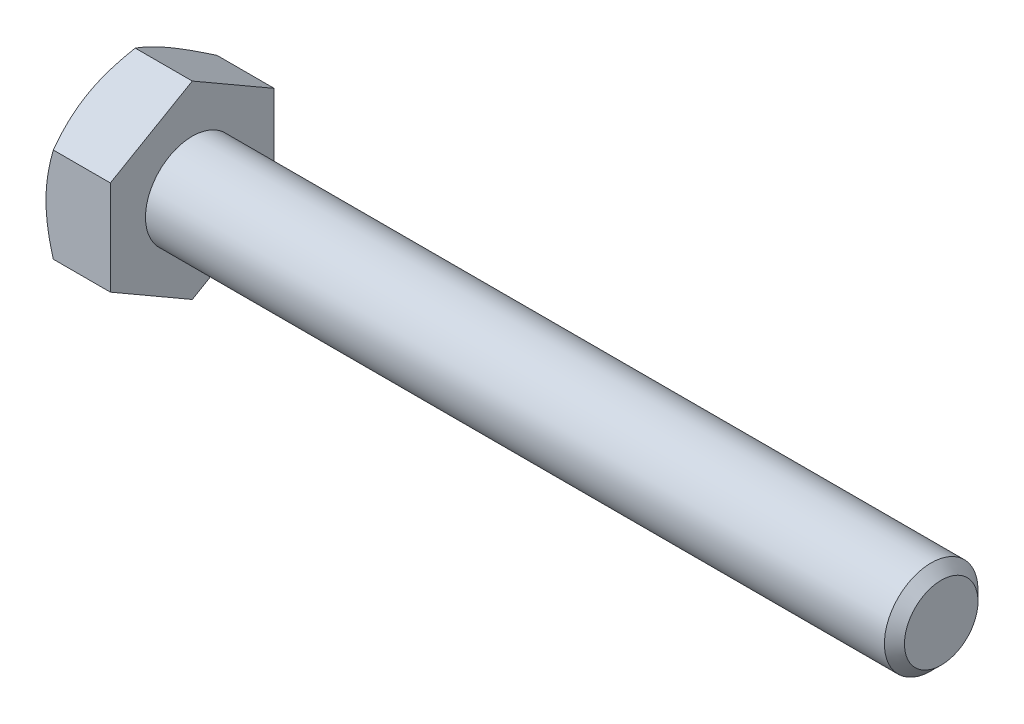
ISO-10303-21;
HEADER;
FILE_DESCRIPTION(('STEP AP214'),'2;1');
FILE_NAME('part.step','',(''),(''),'','','');
FILE_SCHEMA(('AUTOMOTIVE_DESIGN { 1 0 10303 214 1 1 1 1 }'));
ENDSEC;
DATA;
#1=APPLICATION_CONTEXT('core data for automotive mechanical design processes');
#2=APPLICATION_PROTOCOL_DEFINITION('international standard','automotive_design',2000,#1);
#3=PRODUCT_CONTEXT('',#1,'mechanical');
#4=PRODUCT('Part','Part','',(#3));
#5=PRODUCT_RELATED_PRODUCT_CATEGORY('part','',(#4));
#6=PRODUCT_DEFINITION_FORMATION('','',#4);
#7=PRODUCT_DEFINITION_CONTEXT('part definition',#1,'design');
#8=PRODUCT_DEFINITION('design','',#6,#7);
#9=PRODUCT_DEFINITION_SHAPE('','',#8);
#10=(LENGTH_UNIT() NAMED_UNIT(*) SI_UNIT(.MILLI.,.METRE.));
#11=(NAMED_UNIT(*) PLANE_ANGLE_UNIT() SI_UNIT($,.RADIAN.));
#12=(NAMED_UNIT(*) SI_UNIT($,.STERADIAN.) SOLID_ANGLE_UNIT());
#13=UNCERTAINTY_MEASURE_WITH_UNIT(LENGTH_MEASURE(1.E-05),#10,'distance_accuracy_value','');
#14=(GEOMETRIC_REPRESENTATION_CONTEXT(3) GLOBAL_UNCERTAINTY_ASSIGNED_CONTEXT((#13)) GLOBAL_UNIT_ASSIGNED_CONTEXT((#10,
#11,#12)) REPRESENTATION_CONTEXT('',''));
#15=CARTESIAN_POINT('',(0.,0.,0.));
#16=DIRECTION('',(0.,0.,1.));
#17=DIRECTION('',(1.,0.,0.));
#18=AXIS2_PLACEMENT_3D('',#15,#16,#17);
#19=CARTESIAN_POINT('',(-27.5828125,-3.20790243318485,5.55625));
#20=DIRECTION('',(0.,0.,-1.));
#21=DIRECTION('',(0.,1.,0.));
#22=AXIS2_PLACEMENT_3D('',#19,#20,#21);
#23=PLANE('',#22);
#24=CARTESIAN_POINT('',(-24.8093750574616,-8.74399028271723,5.55625));
#25=CARTESIAN_POINT('',(-24.9281476439003,-8.50018624433214,5.55625));
#26=CARTESIAN_POINT('',(-25.0458174877412,-8.25583594838017,5.55625));
#27=CARTESIAN_POINT('',(-25.2783338302931,-7.76575276181023,5.55625));
#28=CARTESIAN_POINT('',(-25.3931799075041,-7.5200196714312,5.55625));
#29=CARTESIAN_POINT('',(-25.6199815650906,-7.02567502758553,5.55625));
#30=CARTESIAN_POINT('',(-25.7319190754759,-6.77705515601885,5.55625));
#31=CARTESIAN_POINT('',(-25.9513791438231,-6.2778816135969,5.55625));
#32=CARTESIAN_POINT('',(-26.0589019023311,-6.02732803119863,5.55625));
#33=CARTESIAN_POINT('',(-26.271906896146,-5.51539046667091,5.55625));
#34=CARTESIAN_POINT('',(-26.3771977000269,-5.25392641272659,5.55625));
#35=CARTESIAN_POINT('',(-26.5801139851458,-4.72798657849261,5.55625));
#36=CARTESIAN_POINT('',(-26.6777386244234,-4.46351047103702,5.55625));
#37=CARTESIAN_POINT('',(-26.8628532154485,-3.93158169041599,5.55625));
#38=CARTESIAN_POINT('',(-26.9503626154158,-3.66413585057298,5.55625));
#39=CARTESIAN_POINT('',(-27.1125224423586,-3.12540698347401,5.55625));
#40=CARTESIAN_POINT('',(-27.187176786064,-2.85412515234023,5.55625));
#41=CARTESIAN_POINT('',(-27.3197361578849,-2.30908269853905,5.55625));
#42=CARTESIAN_POINT('',(-27.3777346690236,-2.03534517245375,5.55625));
#43=CARTESIAN_POINT('',(-27.4737733322196,-1.48429809984412,5.55625));
#44=CARTESIAN_POINT('',(-27.5118156465641,-1.20698894364918,5.55625));
#45=CARTESIAN_POINT('',(-27.5513928026956,-0.791294728945892,5.55625));
#46=CARTESIAN_POINT('',(-27.561658902021,-0.653708209357038,5.55625));
#47=CARTESIAN_POINT('',(-27.576362187288,-0.378228688137561,5.55625));
#48=CARTESIAN_POINT('',(-27.5807999263983,-0.240335716836744,5.55625));
#49=CARTESIAN_POINT('',(-27.5837354775687,0.0355251316508544,5.55625));
#50=CARTESIAN_POINT('',(-27.5822327727923,0.173493014310986,5.55625));
#51=CARTESIAN_POINT('',(-27.5733265100424,0.449228447033502,5.55625));
#52=CARTESIAN_POINT('',(-27.565923181419,0.586996004673774,5.55625));
#53=CARTESIAN_POINT('',(-27.5414869355163,0.914267817860306,5.55625));
#54=CARTESIAN_POINT('',(-27.5218672237309,1.10358331302688,5.55625));
#55=CARTESIAN_POINT('',(-27.4725268119308,1.48088314390515,5.55625));
#56=CARTESIAN_POINT('',(-27.4428048473206,1.66886730995275,5.55625));
#57=CARTESIAN_POINT('',(-27.3400555513119,2.23056094001761,5.55625));
#58=CARTESIAN_POINT('',(-27.2534606125147,2.60182550045217,5.55625));
#59=CARTESIAN_POINT('',(-27.1023261053987,3.15725729103479,5.55625));
#60=CARTESIAN_POINT('',(-27.0476586113424,3.34427702524158,5.55625));
#61=CARTESIAN_POINT('',(-26.932406052333,3.71650215163137,5.55625));
#62=CARTESIAN_POINT('',(-26.8718209419118,3.90170752986172,5.55625));
#63=CARTESIAN_POINT('',(-26.7457250457604,4.27035971442928,5.55625));
#64=CARTESIAN_POINT('',(-26.6802156550753,4.45380700235122,5.55625));
#65=CARTESIAN_POINT('',(-26.5450659129719,4.81916376783227,5.55625));
#66=CARTESIAN_POINT('',(-26.4754256552843,5.00107328017708,5.55625));
#67=CARTESIAN_POINT('',(-26.2830333948253,5.48965634412822,5.55625));
#68=CARTESIAN_POINT('',(-26.1570472750788,5.79505516029649,5.55625));
#69=CARTESIAN_POINT('',(-25.8976962832959,6.40271511827117,5.55625));
#70=CARTESIAN_POINT('',(-25.7643305993156,6.70497591045091,5.55625));
#71=CARTESIAN_POINT('',(-25.4919631126131,7.30707795631466,5.55625));
#72=CARTESIAN_POINT('',(-25.3529591769931,7.60691824193362,5.55625));
#73=CARTESIAN_POINT('',(-25.0706603632321,8.20455030388993,5.55625));
#74=CARTESIAN_POINT('',(-24.9273656584325,8.50234216238501,5.55625));
#75=CARTESIAN_POINT('',(-24.637187083384,9.09675870347433,5.55625));
#76=CARTESIAN_POINT('',(-24.4902978378226,9.39338075659061,5.55625));
#77=CARTESIAN_POINT('',(-24.1938414750758,9.98528417706332,5.55625));
#78=CARTESIAN_POINT('',(-24.0442743357868,10.2805655333282,5.55625));
#79=CARTESIAN_POINT('',(-23.5924394244542,11.1646418998589,5.55625));
#80=CARTESIAN_POINT('',(-23.2869729994491,11.7518013892495,5.55625));
#81=CARTESIAN_POINT('',(-22.7028679574185,12.8613257589912,5.55625));
#82=CARTESIAN_POINT('',(-22.4247985829024,13.3839917749348,5.55625));
#83=CARTESIAN_POINT('',(-21.8653014266466,14.4275635287064,5.55625));
#84=CARTESIAN_POINT('',(-21.5838734397935,14.9484691565073,5.55625));
#85=CARTESIAN_POINT('',(-21.0194769924016,15.9871873035495,5.55625));
#86=CARTESIAN_POINT('',(-20.7365168337457,16.5050043408021,5.55625));
#87=CARTESIAN_POINT('',(-20.1686898642822,17.5395393833806,5.55625));
#88=CARTESIAN_POINT('',(-19.8838232052306,18.0562574719669,5.55625));
#89=CARTESIAN_POINT('',(-19.5982623505101,18.5725892213169,5.55625));
#90=B_SPLINE_CURVE_WITH_KNOTS('',3,(#24,#25,#26,#27,#28,#29,#30,#31,#32,#33,#34,#35,#36,#37,#38,
#39,#40,#41,#42,#43,#44,#45,#46,#47,#48,#49,#50,#51,#52,#53,#54,#55,#56,#57,#58,#59,#60,#61,#62,
#63,#64,#65,#66,#67,#68,#69,#70,#71,#72,#73,#74,#75,#76,#77,#78,#79,#80,#81,#82,#83,#84,#85,#86,
#87,#88,#89),.UNSPECIFIED.,.F.,.F.,(4,2,2,2,2,2,2,2,2,2,2,2,2,2,2,2,2,2,2,2,2,2,2,2,2,2,2,2,2,2,
2,2,4),(0.,0.813597716445731,1.6273161491936,2.44525275827226,3.26315217028693,4.10866348233596,
4.95426752580812,5.79821771718855,6.64191031370899,7.48077064504382,8.31954006567861,
8.73334238532055,9.14710542821065,9.56090447051724,9.97468742974186,10.545356138106,
11.1160963088496,12.258134229421,12.842619474887,13.4271092116055,14.0114339823823,
14.5957454997084,15.5866951993033,16.5777541467498,17.5691915643882,18.5605889831377,
19.5535724737812,20.5465641644216,22.5321054869691,24.3081902186865,26.0843839782317,
27.8546363211013,29.6247493906644),.UNSPECIFIED.);
#91=CARTESIAN_POINT('',(-27.0865482665182,-3.20790243318485,5.55625));
#92=VERTEX_POINT('',#91);
#93=CARTESIAN_POINT('',(-27.5828125,0.,5.55625));
#94=VERTEX_POINT('',#93);
#95=EDGE_CURVE('E277',#92,#94,#90,.T.);
#96=ORIENTED_EDGE('',*,*,#95,.F.);
#97=DIRECTION('',(1.,0.,0.));
#98=VECTOR('',#97,1.);
#99=CARTESIAN_POINT('',(-27.5828125,-3.20790243318485,5.55625));
#100=LINE('',#99,#98);
#101=CARTESIAN_POINT('',(-23.2171875,-3.20790243318485,5.55625));
#102=VERTEX_POINT('',#101);
#103=EDGE_CURVE('E280',#92,#102,#100,.T.);
#104=ORIENTED_EDGE('',*,*,#103,.T.);
#105=DIRECTION('',(0.,1.,0.));
#106=VECTOR('',#105,1.);
#107=CARTESIAN_POINT('',(-23.2171875,-3.20790243318485,5.55625));
#108=LINE('',#107,#106);
#109=CARTESIAN_POINT('',(-23.2171875,3.20790243318486,5.55625));
#110=VERTEX_POINT('',#109);
#111=EDGE_CURVE('E283',#102,#110,#108,.T.);
#112=ORIENTED_EDGE('',*,*,#111,.T.);
#113=DIRECTION('',(1.,0.,0.));
#114=VECTOR('',#113,1.);
#115=CARTESIAN_POINT('',(-27.5828125,3.20790243318486,5.55625));
#116=LINE('',#115,#114);
#117=CARTESIAN_POINT('',(-27.0865482665182,3.20790243318486,5.55625));
#118=VERTEX_POINT('',#117);
#119=EDGE_CURVE('E239',#118,#110,#116,.T.);
#120=ORIENTED_EDGE('',*,*,#119,.F.);
#121=EDGE_CURVE('E117',#94,#118,#90,.T.);
#122=ORIENTED_EDGE('',*,*,#121,.F.);
#123=EDGE_LOOP('',(#96,#104,#112,#120,#122));
#124=FACE_BOUND('',#123,.T.);
#125=ADVANCED_FACE('F40',(#124),#23,.F.);
#126=CARTESIAN_POINT('',(-27.5828125,3.20790243318486,5.55625));
#127=DIRECTION('',(0.,-0.866025403784439,-0.5));
#128=DIRECTION('',(0.,0.5,-0.866025403784439));
#129=AXIS2_PLACEMENT_3D('',#126,#127,#128);
#130=PLANE('',#129);
#131=CARTESIAN_POINT('',(-27.0864815980518,3.20778696313102,5.55645));
#132=CARTESIAN_POINT('',(-27.1271869396287,3.27830048099899,5.43431700443227));
#133=CARTESIAN_POINT('',(-27.1660449606368,3.34907690760433,5.31172863757365));
#134=CARTESIAN_POINT('',(-27.2395575665754,3.49120454378004,5.06555635055764));
#135=CARTESIAN_POINT('',(-27.2742103381981,3.56255598725623,4.94197202526351));
#136=CARTESIAN_POINT('',(-27.3711806144389,3.7777527611819,4.56924027919934));
#137=CARTESIAN_POINT('',(-27.426336445498,3.92244755263586,4.3186215488105));
#138=CARTESIAN_POINT('',(-27.491013595153,4.13898067940738,3.94357517172046));
#139=CARTESIAN_POINT('',(-27.5094383296374,4.21017202280889,3.82026814788997));
#140=CARTESIAN_POINT('',(-27.5403341337597,4.35287639627881,3.57309692257778));
#141=CARTESIAN_POINT('',(-27.552805729438,4.42438939736052,3.44923277130254));
#142=CARTESIAN_POINT('',(-27.5714774134017,4.56753961185542,3.20128932668298));
#143=CARTESIAN_POINT('',(-27.5776846193166,4.63917659144933,3.07721043832556));
#144=CARTESIAN_POINT('',(-27.5837010825862,4.7825127822332,2.82894487332451));
#145=CARTESIAN_POINT('',(-27.5835105375727,4.85421199143242,2.70475820012895));
#146=CARTESIAN_POINT('',(-27.5741942573071,5.05064720059278,2.36452243746779));
#147=CARTESIAN_POINT('',(-27.5585528403106,5.1753189069971,2.14858470770919));
#148=CARTESIAN_POINT('',(-27.5089525950255,5.42383425573453,1.71814349723526));
#149=CARTESIAN_POINT('',(-27.4749768117333,5.54767702400135,1.50364153044716));
#150=CARTESIAN_POINT('',(-27.3900467499519,5.7966925582286,1.07233397329164));
#151=CARTESIAN_POINT('',(-27.3387326119579,5.92183390122649,0.855582809091896));
#152=CARTESIAN_POINT('',(-27.2222700447076,6.17025031750736,0.425312954659246));
#153=CARTESIAN_POINT('',(-27.1571489741206,6.29352857247572,0.21178875358562));
#154=CARTESIAN_POINT('',(-27.0864815980518,6.41592033642355,-0.000200000000001332));
#155=B_SPLINE_CURVE_WITH_KNOTS('',3,(#131,#132,#133,#134,#135,#136,#137,#138,#139,#140,#141,
#142,#143,#144,#145,#146,#147,#148,#149,#150,#151,#152,#153,#154),.UNSPECIFIED.,.F.,.F.,(4,2,2,
2,2,2,2,2,2,2,2,4),(0.,0.440316908268041,0.880823012040825,1.76366572331169,2.19427472390783,
2.62484566732156,3.05492684132792,3.4849947297767,4.23370964386675,4.98311813377593,
5.74914806559356,6.51367405016872),.UNSPECIFIED.);
#156=CARTESIAN_POINT('',(-27.5828125,4.81185364977729,2.778125));
#157=VERTEX_POINT('',#156);
#158=EDGE_CURVE('E113',#118,#157,#155,.T.);
#159=ORIENTED_EDGE('',*,*,#158,.F.);
#160=ORIENTED_EDGE('',*,*,#119,.T.);
#161=DIRECTION('',(0.,0.5,-0.866025403784439));
#162=VECTOR('',#161,1.);
#163=CARTESIAN_POINT('',(-23.2171875,3.20790243318486,5.55625));
#164=LINE('',#163,#162);
#165=CARTESIAN_POINT('',(-23.2171875,6.41580486636971,0.));
#166=VERTEX_POINT('',#165);
#167=EDGE_CURVE('E307',#110,#166,#164,.T.);
#168=ORIENTED_EDGE('',*,*,#167,.T.);
#169=DIRECTION('',(1.,0.,0.));
#170=VECTOR('',#169,1.);
#171=CARTESIAN_POINT('',(-27.5828125,6.41580486636971,0.));
#172=LINE('',#171,#170);
#173=CARTESIAN_POINT('',(-27.0865482665182,6.41580486636971,0.));
#174=VERTEX_POINT('',#173);
#175=EDGE_CURVE('E138',#174,#166,#172,.T.);
#176=ORIENTED_EDGE('',*,*,#175,.F.);
#177=EDGE_CURVE('E122',#157,#174,#155,.T.);
#178=ORIENTED_EDGE('',*,*,#177,.F.);
#179=EDGE_LOOP('',(#159,#160,#168,#176,#178));
#180=FACE_BOUND('',#179,.T.);
#181=ADVANCED_FACE('F136',(#180),#130,.F.);
#182=CARTESIAN_POINT('',(-27.5828125,6.41580486636971,0.));
#183=DIRECTION('',(0.,-0.866025403784439,0.5));
#184=DIRECTION('',(0.,-0.5,-0.866025403784439));
#185=AXIS2_PLACEMENT_3D('',#182,#183,#184);
#186=PLANE('',#185);
#187=CARTESIAN_POINT('',(-27.0864815980518,6.41592033642355,0.000199999999998423));
#188=CARTESIAN_POINT('',(-27.1271869396287,6.34540681855559,-0.121932995567732));
#189=CARTESIAN_POINT('',(-27.1660449606368,6.27463039195025,-0.244521362426354));
#190=CARTESIAN_POINT('',(-27.2395575665754,6.13250275577453,-0.490693649442357));
#191=CARTESIAN_POINT('',(-27.2742103381981,6.06115131229835,-0.614277974736489));
#192=CARTESIAN_POINT('',(-27.3711806144389,5.84595453837268,-0.987009720800664));
#193=CARTESIAN_POINT('',(-27.426336445498,5.70125974691872,-1.2376284511895));
#194=CARTESIAN_POINT('',(-27.491013595153,5.48472662014719,-1.61267482827954));
#195=CARTESIAN_POINT('',(-27.5094383296374,5.41353527674569,-1.73598185211002));
#196=CARTESIAN_POINT('',(-27.5403341337597,5.27083090327576,-1.98315307742222));
#197=CARTESIAN_POINT('',(-27.552805729438,5.19931790219406,-2.10701722869746));
#198=CARTESIAN_POINT('',(-27.5714774134017,5.05616768769915,-2.35496067331702));
#199=CARTESIAN_POINT('',(-27.5776846193166,4.98453070810525,-2.47903956167444));
#200=CARTESIAN_POINT('',(-27.5837010825862,4.84119451732137,-2.72730512667549));
#201=CARTESIAN_POINT('',(-27.5835105375727,4.76949530812215,-2.85149179987105));
#202=CARTESIAN_POINT('',(-27.5741942573071,4.5730600989618,-3.19172756253221));
#203=CARTESIAN_POINT('',(-27.5585528403106,4.44838839255747,-3.40766529229081));
#204=CARTESIAN_POINT('',(-27.5089525950255,4.19987304382004,-3.83810650276474));
#205=CARTESIAN_POINT('',(-27.4749768117333,4.07603027555323,-4.05260846955284));
#206=CARTESIAN_POINT('',(-27.3900467499519,3.82701474132597,-4.48391602670836));
#207=CARTESIAN_POINT('',(-27.3387326119579,3.70187339832808,-4.7006671909081));
#208=CARTESIAN_POINT('',(-27.2222700447076,3.45345698204721,-5.13093704534075));
#209=CARTESIAN_POINT('',(-27.1571489741206,3.33017872707885,-5.34446124641438));
#210=CARTESIAN_POINT('',(-27.0864815980518,3.20778696313102,-5.55645));
#211=B_SPLINE_CURVE_WITH_KNOTS('',3,(#187,#188,#189,#190,#191,#192,#193,#194,#195,#196,#197,
#198,#199,#200,#201,#202,#203,#204,#205,#206,#207,#208,#209,#210),.UNSPECIFIED.,.F.,.F.,(4,2,2,
2,2,2,2,2,2,2,2,4),(0.,0.440316908268041,0.880823012040822,1.76366572331169,2.19427472390783,
2.62484566732156,3.05492684132792,3.48499472977669,4.23370964386674,4.98311813377592,
5.74914806559356,6.51367405016872),.UNSPECIFIED.);
#212=CARTESIAN_POINT('',(-27.5828125,4.81185364977729,-2.778125));
#213=VERTEX_POINT('',#212);
#214=EDGE_CURVE('E127',#174,#213,#211,.T.);
#215=ORIENTED_EDGE('',*,*,#214,.F.);
#216=ORIENTED_EDGE('',*,*,#175,.T.);
#217=DIRECTION('',(0.,-0.5,-0.866025403784439));
#218=VECTOR('',#217,1.);
#219=CARTESIAN_POINT('',(-23.2171875,6.41580486636971,0.));
#220=LINE('',#219,#218);
#221=CARTESIAN_POINT('',(-23.2171875,3.20790243318486,-5.55625));
#222=VERTEX_POINT('',#221);
#223=EDGE_CURVE('E304',#166,#222,#220,.T.);
#224=ORIENTED_EDGE('',*,*,#223,.T.);
#225=DIRECTION('',(1.,0.,0.));
#226=VECTOR('',#225,1.);
#227=CARTESIAN_POINT('',(-27.5828125,3.20790243318486,-5.55625));
#228=LINE('',#227,#226);
#229=CARTESIAN_POINT('',(-27.0865482665182,3.20790243318486,-5.55625));
#230=VERTEX_POINT('',#229);
#231=EDGE_CURVE('E299',#230,#222,#228,.T.);
#232=ORIENTED_EDGE('',*,*,#231,.F.);
#233=EDGE_CURVE('E141',#213,#230,#211,.T.);
#234=ORIENTED_EDGE('',*,*,#233,.F.);
#235=EDGE_LOOP('',(#215,#216,#224,#232,#234));
#236=FACE_BOUND('',#235,.T.);
#237=ADVANCED_FACE('F202',(#236),#186,.F.);
#238=CARTESIAN_POINT('',(-27.5828125,3.20790243318486,-5.55625));
#239=DIRECTION('',(0.,0.,1.));
#240=DIRECTION('',(0.,-1.,0.));
#241=AXIS2_PLACEMENT_3D('',#238,#239,#240);
#242=PLANE('',#241);
#243=CARTESIAN_POINT('',(-24.8093750598475,-8.74399027782085,-5.55624999999999));
#244=CARTESIAN_POINT('',(-24.9281476461868,-8.50018623960062,-5.55624999999999));
#245=CARTESIAN_POINT('',(-25.0458174899284,-8.25583594381362,-5.55624999999999));
#246=CARTESIAN_POINT('',(-25.278333832282,-7.76575275757412,-5.55624999999999));
#247=CARTESIAN_POINT('',(-25.393179909394,-7.52001966736056,-5.55624999999999));
#248=CARTESIAN_POINT('',(-25.6199815667827,-7.02567502384834,-5.55624999999999));
#249=CARTESIAN_POINT('',(-25.7319190770691,-6.77705515244963,-5.55624999999999));
#250=CARTESIAN_POINT('',(-25.9513791452201,-6.27788161036475,-5.55624999999999));
#251=CARTESIAN_POINT('',(-26.0589019036307,-6.02732802813559,-5.55624999999999));
#252=CARTESIAN_POINT('',(-26.2719068972482,-5.51539046395943,-5.55624999999999));
#253=CARTESIAN_POINT('',(-26.377197701029,-5.25392641019769,-5.55624999999999));
#254=CARTESIAN_POINT('',(-26.5801139859531,-4.72798657633179,-5.55624999999999));
#255=CARTESIAN_POINT('',(-26.6777386251359,-4.46351046906169,-5.55624999999999));
#256=CARTESIAN_POINT('',(-26.8628532159805,-3.93158168881508,-5.55624999999999));
#257=CARTESIAN_POINT('',(-26.9503626158621,-3.66413584916098,-5.55624999999999));
#258=CARTESIAN_POINT('',(-27.1125224426472,-3.12540698244495,-5.55624999999999));
#259=CARTESIAN_POINT('',(-27.1871767862806,-2.8541251515052,-5.55624999999999));
#260=CARTESIAN_POINT('',(-27.3197361579562,-2.30908269819076,-5.55624999999999));
#261=CARTESIAN_POINT('',(-27.3777346690269,-2.03534517239951,-5.55624999999999));
#262=CARTESIAN_POINT('',(-27.4737733321313,-1.4842981003853,-5.55624999999999));
#263=CARTESIAN_POINT('',(-27.5118156464521,-1.20698894449172,-5.55625));
#264=CARTESIAN_POINT('',(-27.5513928025883,-0.791294730238443,-5.55625));
#265=CARTESIAN_POINT('',(-27.5616589019217,-0.653708210797408,-5.55625));
#266=CARTESIAN_POINT('',(-27.5763621872178,-0.378228689873304,-5.55625));
#267=CARTESIAN_POINT('',(-27.5807999263492,-0.24033571872004,-5.55625));
#268=CARTESIAN_POINT('',(-27.5837354775746,0.0355251294734925,-5.55625));
#269=CARTESIAN_POINT('',(-27.5822327728321,0.173493011987112,-5.55625));
#270=CARTESIAN_POINT('',(-27.5733265101621,0.449228444418531,-5.55625));
#271=CARTESIAN_POINT('',(-27.5659231815845,0.586996001914216,-5.55625));
#272=CARTESIAN_POINT('',(-27.5414869357947,0.914267814878998,-5.55625));
#273=CARTESIAN_POINT('',(-27.5218672240741,1.10358330996903,-5.55625));
#274=CARTESIAN_POINT('',(-27.472526812407,1.48088314069774,-5.55625));
#275=CARTESIAN_POINT('',(-27.4428048478651,1.66886730667231,-5.55625));
#276=CARTESIAN_POINT('',(-27.3400555520625,2.23056093652212,-5.55625));
#277=CARTESIAN_POINT('',(-27.2534606134045,2.60182549681905,-5.55625));
#278=CARTESIAN_POINT('',(-27.1023261064939,3.15725728719582,-5.55625));
#279=CARTESIAN_POINT('',(-27.0476586125065,3.34427702133249,-5.55625));
#280=CARTESIAN_POINT('',(-26.9324060536328,3.71650214758285,-5.55625));
#281=CARTESIAN_POINT('',(-26.8718209432783,3.90170752574389,-5.55625));
#282=CARTESIAN_POINT('',(-26.7457250472581,4.27035971017337,-5.55625));
#283=CARTESIAN_POINT('',(-26.6802156566373,4.45380699802653,-5.55625));
#284=CARTESIAN_POINT('',(-26.5450659146603,4.81916376337001,-5.55625));
#285=CARTESIAN_POINT('',(-26.4754256570347,5.00107327564603,-5.55625));
#286=CARTESIAN_POINT('',(-26.2830333966823,5.48965633955827,-5.55625));
#287=CARTESIAN_POINT('',(-26.1570472769738,5.7950551557544,-5.55625));
#288=CARTESIAN_POINT('',(-25.8976962852557,6.40271511378119,-5.55625));
#289=CARTESIAN_POINT('',(-25.7643306013024,6.70497590598519,-5.55625));
#290=CARTESIAN_POINT('',(-25.4919631146458,7.3070779518949,-5.55625));
#291=CARTESIAN_POINT('',(-25.3529591790448,7.60691823753553,-5.55625));
#292=CARTESIAN_POINT('',(-25.0706603653161,8.20455029953285,-5.55625));
#293=CARTESIAN_POINT('',(-24.9273656605298,8.50234215804726,-5.55625));
#294=CARTESIAN_POINT('',(-24.6371870855033,9.09675869917466,-5.55625));
#295=CARTESIAN_POINT('',(-24.4902978399505,9.3933807523097,-5.55625));
#296=CARTESIAN_POINT('',(-24.193841477218,9.98528417281851,-5.55625));
#297=CARTESIAN_POINT('',(-24.0442743379345,10.2805655291007,-5.55625));
#298=CARTESIAN_POINT('',(-23.5924394266152,11.1646418956815,-5.55625));
#299=CARTESIAN_POINT('',(-23.2869730016145,11.7518013851031,-5.55625));
#300=CARTESIAN_POINT('',(-22.7028679596005,12.8613257548756,-5.55625));
#301=CARTESIAN_POINT('',(-22.4247985850975,13.3839917708193,-5.55625));
#302=CARTESIAN_POINT('',(-21.865301428865,14.42756352459,-5.55625));
#303=CARTESIAN_POINT('',(-21.5838734420222,14.9484691523898,-5.55625));
#304=CARTESIAN_POINT('',(-21.0194769946515,15.9871872994245,-5.55625));
#305=CARTESIAN_POINT('',(-20.7365168360065,16.5050043366708,-5.55625));
#306=CARTESIAN_POINT('',(-20.1686898665637,17.5395393792358,-5.55625));
#307=CARTESIAN_POINT('',(-19.8838232075218,18.056257467815,-5.55625));
#308=CARTESIAN_POINT('',(-19.5982623528106,18.5725892171576,-5.55625));
#309=B_SPLINE_CURVE_WITH_KNOTS('',3,(#243,#244,#245,#246,#247,#248,#249,#250,#251,#252,#253,
#254,#255,#256,#257,#258,#259,#260,#261,#262,#263,#264,#265,#266,#267,#268,#269,#270,#271,#272,
#273,#274,#275,#276,#277,#278,#279,#280,#281,#282,#283,#284,#285,#286,#287,#288,#289,#290,#291,
#292,#293,#294,#295,#296,#297,#298,#299,#300,#301,#302,#303,#304,#305,#306,#307,#308),
.UNSPECIFIED.,.F.,.F.,(4,2,2,2,2,2,2,2,2,2,2,2,2,2,2,2,2,2,2,2,2,2,2,2,2,2,2,2,2,2,2,2,4),(0.,
0.813597715870463,1.62731614804298,2.44525275654031,3.26315216797368,4.10866347940256,
4.95426752225437,5.79821771301645,6.64191030891902,7.48077063935046,8.31954005908317,
8.73334237828505,9.14710542073519,9.56090446260156,9.97468742138602,10.5453561295019,
11.1160962999972,12.2581342200709,12.8426194652768,13.4271092017353,14.0114339722529,
14.5957454893196,15.5866951889479,16.5777541364282,17.5691915541016,18.5605889728859,
19.5535724635683,20.5465641542476,22.5321054768716,24.308190208571,26.0843839680985,
27.8546363109357,29.624749380466),.UNSPECIFIED.);
#310=CARTESIAN_POINT('',(-27.5828125,0.,-5.55625));
#311=VERTEX_POINT('',#310);
#312=EDGE_CURVE('E196',#230,#311,#309,.F.);
#313=ORIENTED_EDGE('',*,*,#312,.F.);
#314=ORIENTED_EDGE('',*,*,#231,.T.);
#315=DIRECTION('',(0.,-1.,0.));
#316=VECTOR('',#315,1.);
#317=CARTESIAN_POINT('',(-23.2171875,3.20790243318486,-5.55625));
#318=LINE('',#317,#316);
#319=CARTESIAN_POINT('',(-23.2171875,-3.20790243318486,-5.55624999999999));
#320=VERTEX_POINT('',#319);
#321=EDGE_CURVE('E312',#222,#320,#318,.T.);
#322=ORIENTED_EDGE('',*,*,#321,.T.);
#323=DIRECTION('',(1.,0.,0.));
#324=VECTOR('',#323,1.);
#325=CARTESIAN_POINT('',(-27.5828125,-3.20790243318486,-5.55624999999999));
#326=LINE('',#325,#324);
#327=CARTESIAN_POINT('',(-27.0865482665182,-3.20790243318486,-5.55624999999999));
#328=VERTEX_POINT('',#327);
#329=EDGE_CURVE('E261',#328,#320,#326,.T.);
#330=ORIENTED_EDGE('',*,*,#329,.F.);
#331=EDGE_CURVE('E189',#311,#328,#309,.F.);
#332=ORIENTED_EDGE('',*,*,#331,.F.);
#333=EDGE_LOOP('',(#313,#314,#322,#330,#332));
#334=FACE_BOUND('',#333,.T.);
#335=ADVANCED_FACE('F198',(#334),#242,.F.);
#336=CARTESIAN_POINT('',(-27.5828125,-3.20790243318486,-5.55624999999999));
#337=DIRECTION('',(0.,0.866025403784439,0.5));
#338=DIRECTION('',(0.,-0.5,0.866025403784439));
#339=AXIS2_PLACEMENT_3D('',#336,#337,#338);
#340=PLANE('',#339);
#341=CARTESIAN_POINT('',(-27.0864815980518,-3.20778696313102,-5.55644999999999));
#342=CARTESIAN_POINT('',(-27.1271869396287,-3.27830048099898,-5.43431700443226));
#343=CARTESIAN_POINT('',(-27.1660449606368,-3.34907690760432,-5.31172863757364));
#344=CARTESIAN_POINT('',(-27.2395575665754,-3.49120454378004,-5.06555635055764));
#345=CARTESIAN_POINT('',(-27.2742103381981,-3.56255598725622,-4.94197202526351));
#346=CARTESIAN_POINT('',(-27.3711806144389,-3.7777527611819,-4.56924027919933));
#347=CARTESIAN_POINT('',(-27.426336445498,-3.92244755263585,-4.31862154881049));
#348=CARTESIAN_POINT('',(-27.491013595153,-4.13898067940738,-3.94357517172046));
#349=CARTESIAN_POINT('',(-27.5094383296374,-4.21017202280888,-3.82026814788997));
#350=CARTESIAN_POINT('',(-27.5403341337597,-4.35287639627881,-3.57309692257778));
#351=CARTESIAN_POINT('',(-27.552805729438,-4.42438939736051,-3.44923277130254));
#352=CARTESIAN_POINT('',(-27.5714774134017,-4.56753961185542,-3.20128932668298));
#353=CARTESIAN_POINT('',(-27.5776846193166,-4.63917659144932,-3.07721043832556));
#354=CARTESIAN_POINT('',(-27.5837010825862,-4.7825127822332,-2.82894487332451));
#355=CARTESIAN_POINT('',(-27.5835105375727,-4.85421199143242,-2.70475820012895));
#356=CARTESIAN_POINT('',(-27.5741942573071,-5.05064720059277,-2.36452243746779));
#357=CARTESIAN_POINT('',(-27.5585528403106,-5.1753189069971,-2.14858470770919));
#358=CARTESIAN_POINT('',(-27.5089525950255,-5.42383425573453,-1.71814349723526));
#359=CARTESIAN_POINT('',(-27.4749768117333,-5.54767702400134,-1.50364153044716));
#360=CARTESIAN_POINT('',(-27.3900467499519,-5.7966925582286,-1.07233397329164));
#361=CARTESIAN_POINT('',(-27.3387326119579,-5.92183390122649,-0.855582809091897));
#362=CARTESIAN_POINT('',(-27.2222700447076,-6.17025031750736,-0.425312954659247));
#363=CARTESIAN_POINT('',(-27.1571489741206,-6.29352857247572,-0.21178875358562));
#364=CARTESIAN_POINT('',(-27.0864815980518,-6.41592033642355,0.00020000000000014));
#365=B_SPLINE_CURVE_WITH_KNOTS('',3,(#341,#342,#343,#344,#345,#346,#347,#348,#349,#350,#351,
#352,#353,#354,#355,#356,#357,#358,#359,#360,#361,#362,#363,#364),.UNSPECIFIED.,.F.,.F.,(4,2,2,
2,2,2,2,2,2,2,2,4),(0.,0.44031690826804,0.880823012040823,1.76366572331169,2.19427472390783,
2.62484566732156,3.05492684132791,3.48499472977669,4.23370964386674,4.98311813377593,
5.74914806559356,6.51367405016872),.UNSPECIFIED.);
#366=CARTESIAN_POINT('',(-27.5828125,-4.81185364977729,-2.778125));
#367=VERTEX_POINT('',#366);
#368=EDGE_CURVE('E197',#328,#367,#365,.T.);
#369=ORIENTED_EDGE('',*,*,#368,.F.);
#370=ORIENTED_EDGE('',*,*,#329,.T.);
#371=DIRECTION('',(0.,-0.5,0.866025403784439));
#372=VECTOR('',#371,1.);
#373=CARTESIAN_POINT('',(-23.2171875,-3.20790243318486,-5.55624999999999));
#374=LINE('',#373,#372);
#375=CARTESIAN_POINT('',(-23.2171875,-6.41580486636971,0.));
#376=VERTEX_POINT('',#375);
#377=EDGE_CURVE('E293',#320,#376,#374,.T.);
#378=ORIENTED_EDGE('',*,*,#377,.T.);
#379=DIRECTION('',(1.,0.,0.));
#380=VECTOR('',#379,1.);
#381=CARTESIAN_POINT('',(-27.5828125,-6.41580486636971,0.));
#382=LINE('',#381,#380);
#383=CARTESIAN_POINT('',(-27.0865482665182,-6.41580486636971,0.));
#384=VERTEX_POINT('',#383);
#385=EDGE_CURVE('E288',#384,#376,#382,.T.);
#386=ORIENTED_EDGE('',*,*,#385,.F.);
#387=EDGE_CURVE('E183',#367,#384,#365,.T.);
#388=ORIENTED_EDGE('',*,*,#387,.F.);
#389=EDGE_LOOP('',(#369,#370,#378,#386,#388));
#390=FACE_BOUND('',#389,.T.);
#391=ADVANCED_FACE('F201',(#390),#340,.F.);
#392=CARTESIAN_POINT('',(-27.5828125,-6.41580486636971,0.));
#393=DIRECTION('',(0.,0.866025403784439,-0.5));
#394=DIRECTION('',(0.,0.5,0.866025403784439));
#395=AXIS2_PLACEMENT_3D('',#392,#393,#394);
#396=PLANE('',#395);
#397=CARTESIAN_POINT('',(-27.0864815980518,-6.41592033642355,-0.000200000000000443));
#398=CARTESIAN_POINT('',(-27.1271869396287,-6.34540681855558,0.12193299556773));
#399=CARTESIAN_POINT('',(-27.1660449606368,-6.27463039195024,0.244521362426353));
#400=CARTESIAN_POINT('',(-27.2395575665754,-6.13250275577453,0.490693649442356));
#401=CARTESIAN_POINT('',(-27.2742103381981,-6.06115131229834,0.614277974736487));
#402=CARTESIAN_POINT('',(-27.3711806144389,-5.84595453837267,0.987009720800661));
#403=CARTESIAN_POINT('',(-27.426336445498,-5.70125974691871,1.2376284511895));
#404=CARTESIAN_POINT('',(-27.491013595153,-5.48472662014719,1.61267482827954));
#405=CARTESIAN_POINT('',(-27.5094383296374,-5.41353527674569,1.73598185211002));
#406=CARTESIAN_POINT('',(-27.5403341337597,-5.27083090327576,1.98315307742221));
#407=CARTESIAN_POINT('',(-27.552805729438,-5.19931790219405,2.10701722869746));
#408=CARTESIAN_POINT('',(-27.5714774134017,-5.05616768769915,2.35496067331701));
#409=CARTESIAN_POINT('',(-27.5776846193166,-4.98453070810524,2.47903956167444));
#410=CARTESIAN_POINT('',(-27.5837010825862,-4.84119451732137,2.72730512667549));
#411=CARTESIAN_POINT('',(-27.5835105375727,-4.76949530812215,2.85149179987105));
#412=CARTESIAN_POINT('',(-27.5741942573071,-4.5730600989618,3.1917275625322));
#413=CARTESIAN_POINT('',(-27.5585528403106,-4.44838839255747,3.40766529229081));
#414=CARTESIAN_POINT('',(-27.5089525950255,-4.19987304382004,3.83810650276474));
#415=CARTESIAN_POINT('',(-27.4749768117333,-4.07603027555322,4.05260846955284));
#416=CARTESIAN_POINT('',(-27.3900467499519,-3.82701474132596,4.48391602670836));
#417=CARTESIAN_POINT('',(-27.3387326119579,-3.70187339832808,4.7006671909081));
#418=CARTESIAN_POINT('',(-27.2222700447076,-3.45345698204721,5.13093704534075));
#419=CARTESIAN_POINT('',(-27.1571489741206,-3.33017872707885,5.34446124641438));
#420=CARTESIAN_POINT('',(-27.0864815980518,-3.20778696313102,5.55645));
#421=B_SPLINE_CURVE_WITH_KNOTS('',3,(#397,#398,#399,#400,#401,#402,#403,#404,#405,#406,#407,
#408,#409,#410,#411,#412,#413,#414,#415,#416,#417,#418,#419,#420),.UNSPECIFIED.,.F.,.F.,(4,2,2,
2,2,2,2,2,2,2,2,4),(0.,0.440316908268041,0.880823012040823,1.76366572331169,2.19427472390783,
2.62484566732156,3.05492684132792,3.48499472977669,4.23370964386675,4.98311813377593,
5.74914806559356,6.51367405016873),.UNSPECIFIED.);
#422=CARTESIAN_POINT('',(-27.5828125,-4.81185364977728,2.778125));
#423=VERTEX_POINT('',#422);
#424=EDGE_CURVE('E270',#384,#423,#421,.T.);
#425=ORIENTED_EDGE('',*,*,#424,.F.);
#426=ORIENTED_EDGE('',*,*,#385,.T.);
#427=DIRECTION('',(0.,0.5,0.866025403784439));
#428=VECTOR('',#427,1.);
#429=CARTESIAN_POINT('',(-23.2171875,-6.41580486636971,0.));
#430=LINE('',#429,#428);
#431=EDGE_CURVE('E285',#376,#102,#430,.T.);
#432=ORIENTED_EDGE('',*,*,#431,.T.);
#433=ORIENTED_EDGE('',*,*,#103,.F.);
#434=EDGE_CURVE('E133',#423,#92,#421,.T.);
#435=ORIENTED_EDGE('',*,*,#434,.F.);
#436=EDGE_LOOP('',(#425,#426,#432,#433,#435));
#437=FACE_BOUND('',#436,.T.);
#438=ADVANCED_FACE('F223',(#437),#396,.F.);
#439=CARTESIAN_POINT('',(-23.2171875,0.,0.));
#440=DIRECTION('',(1.,0.,0.));
#441=DIRECTION('',(0.,0.,-1.));
#442=AXIS2_PLACEMENT_3D('',#439,#440,#441);
#443=CYLINDRICAL_SURFACE('',#442,3.175);
#444=CARTESIAN_POINT('',(26.9024553571429,0.,0.));
#445=DIRECTION('',(1.,0.,0.));
#446=DIRECTION('',(0.,0.,-1.));
#447=AXIS2_PLACEMENT_3D('',#444,#445,#446);
#448=CIRCLE('',#447,3.175);
#449=CARTESIAN_POINT('',(26.9024553571429,0.,-3.175));
#450=VERTEX_POINT('',#449);
#451=EDGE_CURVE('E232',#450,#450,#448,.F.);
#452=ORIENTED_EDGE('',*,*,#451,.T.);
#453=EDGE_LOOP('',(#452));
#454=FACE_BOUND('',#453,.T.);
#455=CARTESIAN_POINT('',(-23.2171875,0.,0.));
#456=DIRECTION('',(-1.,0.,0.));
#457=DIRECTION('',(0.,0.,1.));
#458=AXIS2_PLACEMENT_3D('',#455,#456,#457);
#459=CIRCLE('',#458,3.175);
#460=CARTESIAN_POINT('',(-23.2171875,0.,3.175));
#461=VERTEX_POINT('',#460);
#462=EDGE_CURVE('E235',#461,#461,#459,.F.);
#463=ORIENTED_EDGE('',*,*,#462,.T.);
#464=EDGE_LOOP('',(#463));
#465=FACE_BOUND('',#464,.T.);
#466=ADVANCED_FACE('F220',(#454,#465),#443,.T.);
#467=CARTESIAN_POINT('',(27.5828125,0.,0.));
#468=DIRECTION('',(1.,0.,0.));
#469=DIRECTION('',(0.,0.,-1.));
#470=AXIS2_PLACEMENT_3D('',#467,#468,#469);
#471=PLANE('',#470);
#472=CARTESIAN_POINT('',(27.5828125,0.,0.));
#473=DIRECTION('',(1.,0.,0.));
#474=DIRECTION('',(0.,0.,-1.));
#475=AXIS2_PLACEMENT_3D('',#472,#473,#474);
#476=CIRCLE('',#475,2.49464285714286);
#477=CARTESIAN_POINT('',(27.5828125,0.,-2.49464285714286));
#478=VERTEX_POINT('',#477);
#479=EDGE_CURVE('E238',#478,#478,#476,.T.);
#480=ORIENTED_EDGE('',*,*,#479,.T.);
#481=EDGE_LOOP('',(#480));
#482=FACE_BOUND('',#481,.T.);
#483=ADVANCED_FACE('F218',(#482),#471,.T.);
#484=CARTESIAN_POINT('',(27.5828125,0.,0.));
#485=DIRECTION('',(-1.,0.,0.));
#486=DIRECTION('',(0.,0.,1.));
#487=AXIS2_PLACEMENT_3D('',#484,#485,#486);
#488=CONICAL_SURFACE('',#487,2.49464285714286,0.78539816339745);
#489=ORIENTED_EDGE('',*,*,#451,.F.);
#490=EDGE_LOOP('',(#489));
#491=FACE_BOUND('',#490,.T.);
#492=ORIENTED_EDGE('',*,*,#479,.F.);
#493=EDGE_LOOP('',(#492));
#494=FACE_BOUND('',#493,.T.);
#495=ADVANCED_FACE('F42',(#491,#494),#488,.T.);
#496=CARTESIAN_POINT('',(-23.2171875,3.20790243318486,5.55625));
#497=DIRECTION('',(-1.,0.,0.));
#498=DIRECTION('',(0.,0.,1.));
#499=AXIS2_PLACEMENT_3D('',#496,#497,#498);
#500=PLANE('',#499);
#501=ORIENTED_EDGE('',*,*,#462,.F.);
#502=EDGE_LOOP('',(#501));
#503=FACE_BOUND('',#502,.T.);
#504=ORIENTED_EDGE('',*,*,#111,.F.);
#505=ORIENTED_EDGE('',*,*,#431,.F.);
#506=ORIENTED_EDGE('',*,*,#377,.F.);
#507=ORIENTED_EDGE('',*,*,#321,.F.);
#508=ORIENTED_EDGE('',*,*,#223,.F.);
#509=ORIENTED_EDGE('',*,*,#167,.F.);
#510=EDGE_LOOP('',(#504,#505,#506,#507,#508,#509));
#511=FACE_BOUND('',#510,.T.);
#512=ADVANCED_FACE('F168',(#503,#511),#500,.F.);
#513=CARTESIAN_POINT('',(-27.5828125,0.,0.));
#514=DIRECTION('',(1.,0.,0.));
#515=DIRECTION('',(0.,0.,1.));
#516=AXIS2_PLACEMENT_3D('',#513,#514,#515);
#517=CONICAL_SURFACE('',#516,5.55625,1.0471975511966);
#518=ORIENTED_EDGE('',*,*,#95,.T.);
#519=CARTESIAN_POINT('',(-27.5828125,0.,0.));
#520=DIRECTION('',(-1.,0.,0.));
#521=DIRECTION('',(0.,0.,1.));
#522=AXIS2_PLACEMENT_3D('',#519,#520,#521);
#523=CIRCLE('',#522,5.55625);
#524=EDGE_CURVE('E44',#423,#94,#523,.T.);
#525=ORIENTED_EDGE('',*,*,#524,.F.);
#526=ORIENTED_EDGE('',*,*,#434,.T.);
#527=EDGE_LOOP('',(#518,#525,#526));
#528=FACE_BOUND('',#527,.T.);
#529=ADVANCED_FACE('F163',(#528),#517,.T.);
#530=ORIENTED_EDGE('',*,*,#387,.T.);
#531=ORIENTED_EDGE('',*,*,#424,.T.);
#532=EDGE_CURVE('E65',#367,#423,#523,.T.);
#533=ORIENTED_EDGE('',*,*,#532,.F.);
#534=EDGE_LOOP('',(#530,#531,#533));
#535=FACE_BOUND('',#534,.T.);
#536=ADVANCED_FACE('F167',(#535),#517,.T.);
#537=ORIENTED_EDGE('',*,*,#331,.T.);
#538=ORIENTED_EDGE('',*,*,#368,.T.);
#539=EDGE_CURVE('E250',#311,#367,#523,.T.);
#540=ORIENTED_EDGE('',*,*,#539,.F.);
#541=EDGE_LOOP('',(#537,#538,#540));
#542=FACE_BOUND('',#541,.T.);
#543=ADVANCED_FACE('F264',(#542),#517,.T.);
#544=ORIENTED_EDGE('',*,*,#233,.T.);
#545=ORIENTED_EDGE('',*,*,#312,.T.);
#546=EDGE_CURVE('E50',#213,#311,#523,.T.);
#547=ORIENTED_EDGE('',*,*,#546,.F.);
#548=EDGE_LOOP('',(#544,#545,#547));
#549=FACE_BOUND('',#548,.T.);
#550=ADVANCED_FACE('F322',(#549),#517,.T.);
#551=ORIENTED_EDGE('',*,*,#177,.T.);
#552=ORIENTED_EDGE('',*,*,#214,.T.);
#553=EDGE_CURVE('E12',#157,#213,#523,.T.);
#554=ORIENTED_EDGE('',*,*,#553,.F.);
#555=EDGE_LOOP('',(#551,#552,#554));
#556=FACE_BOUND('',#555,.T.);
#557=ADVANCED_FACE('F125',(#556),#517,.T.);
#558=ORIENTED_EDGE('',*,*,#121,.T.);
#559=ORIENTED_EDGE('',*,*,#158,.T.);
#560=CARTESIAN_POINT('',(-27.5828125,0.,0.));
#561=DIRECTION('',(-1.,0.,0.));
#562=DIRECTION('',(0.,0.,1.));
#563=AXIS2_PLACEMENT_3D('',#560,#561,#562);
#564=CIRCLE('',#563,5.55625);
#565=EDGE_CURVE('E57',#94,#157,#564,.T.);
#566=ORIENTED_EDGE('',*,*,#565,.F.);
#567=EDGE_LOOP('',(#558,#559,#566));
#568=FACE_BOUND('',#567,.T.);
#569=ADVANCED_FACE('F115',(#568),#517,.T.);
#570=CARTESIAN_POINT('',(-27.5828125,3.20790243318486,5.55625));
#571=DIRECTION('',(-1.,0.,0.));
#572=DIRECTION('',(0.,0.,1.));
#573=AXIS2_PLACEMENT_3D('',#570,#571,#572);
#574=PLANE('',#573);
#575=ORIENTED_EDGE('',*,*,#524,.T.);
#576=ORIENTED_EDGE('',*,*,#565,.T.);
#577=ORIENTED_EDGE('',*,*,#553,.T.);
#578=ORIENTED_EDGE('',*,*,#546,.T.);
#579=ORIENTED_EDGE('',*,*,#539,.T.);
#580=ORIENTED_EDGE('',*,*,#532,.T.);
#581=EDGE_LOOP('',(#575,#576,#577,#578,#579,#580));
#582=FACE_BOUND('',#581,.T.);
#583=ADVANCED_FACE('F131',(#582),#574,.T.);
#584=CLOSED_SHELL('',(#125,#181,#237,#335,#391,#438,#466,#483,#495,#512,#529,#536,#543,#550,
#557,#569,#583));
#585=MANIFOLD_SOLID_BREP('B2',#584);
#586=ADVANCED_BREP_SHAPE_REPRESENTATION('',(#18,#585),#14);
#587=SHAPE_DEFINITION_REPRESENTATION(#9,#586);
ENDSEC;
END-ISO-10303-21;
